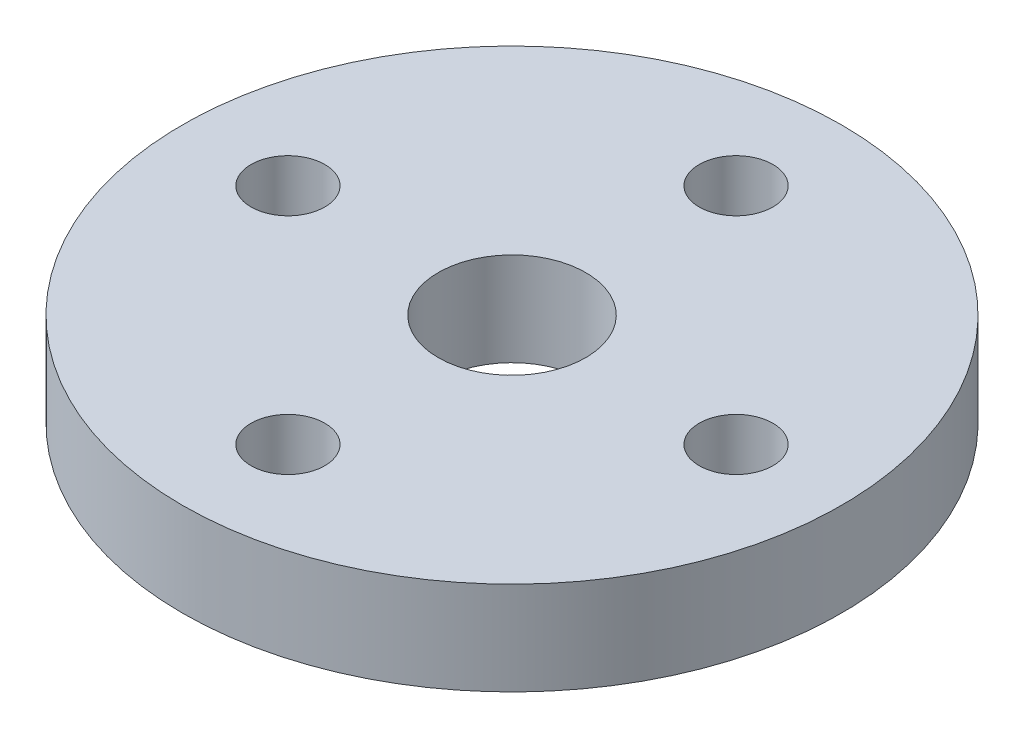
ISO-10303-21;
HEADER;
FILE_DESCRIPTION(('STEP AP214'),'2;1');
FILE_NAME('part.step','',(''),(''),'','','');
FILE_SCHEMA(('AUTOMOTIVE_DESIGN { 1 0 10303 214 1 1 1 1 }'));
ENDSEC;
DATA;
#1=APPLICATION_CONTEXT('core data for automotive mechanical design processes');
#2=APPLICATION_PROTOCOL_DEFINITION('international standard','automotive_design',2000,#1);
#3=PRODUCT_CONTEXT('',#1,'mechanical');
#4=PRODUCT('Part','Part','',(#3));
#5=PRODUCT_RELATED_PRODUCT_CATEGORY('part','',(#4));
#6=PRODUCT_DEFINITION_FORMATION('','',#4);
#7=PRODUCT_DEFINITION_CONTEXT('part definition',#1,'design');
#8=PRODUCT_DEFINITION('design','',#6,#7);
#9=PRODUCT_DEFINITION_SHAPE('','',#8);
#10=(LENGTH_UNIT() NAMED_UNIT(*) SI_UNIT(.MILLI.,.METRE.));
#11=(NAMED_UNIT(*) PLANE_ANGLE_UNIT() SI_UNIT($,.RADIAN.));
#12=(NAMED_UNIT(*) SI_UNIT($,.STERADIAN.) SOLID_ANGLE_UNIT());
#13=UNCERTAINTY_MEASURE_WITH_UNIT(LENGTH_MEASURE(1.E-05),#10,'distance_accuracy_value','');
#14=(GEOMETRIC_REPRESENTATION_CONTEXT(3) GLOBAL_UNCERTAINTY_ASSIGNED_CONTEXT((#13)) GLOBAL_UNIT_ASSIGNED_CONTEXT((#10,
#11,#12)) REPRESENTATION_CONTEXT('',''));
#15=CARTESIAN_POINT('',(0.,0.,0.));
#16=DIRECTION('',(0.,0.,1.));
#17=DIRECTION('',(1.,0.,0.));
#18=AXIS2_PLACEMENT_3D('',#15,#16,#17);
#19=CARTESIAN_POINT('',(0.,5.,0.));
#20=DIRECTION('',(0.,1.,0.));
#21=DIRECTION('',(0.,0.,1.));
#22=AXIS2_PLACEMENT_3D('',#19,#20,#21);
#23=PLANE('',#22);
#24=CARTESIAN_POINT('',(12.,5.,0.));
#25=DIRECTION('',(0.,1.,0.));
#26=DIRECTION('',(0.,0.,-1.));
#27=AXIS2_PLACEMENT_3D('',#24,#25,#26);
#28=CIRCLE('',#27,1.975);
#29=CARTESIAN_POINT('',(12.,5.,-1.975));
#30=VERTEX_POINT('',#29);
#31=EDGE_CURVE('E62',#30,#30,#28,.T.);
#32=ORIENTED_EDGE('',*,*,#31,.F.);
#33=EDGE_LOOP('',(#32));
#34=FACE_BOUND('',#33,.T.);
#35=CARTESIAN_POINT('',(0.,5.,-12.));
#36=DIRECTION('',(0.,1.,0.));
#37=DIRECTION('',(0.,0.,1.));
#38=AXIS2_PLACEMENT_3D('',#35,#36,#37);
#39=CIRCLE('',#38,1.975);
#40=CARTESIAN_POINT('',(0.,5.,-10.025));
#41=VERTEX_POINT('',#40);
#42=EDGE_CURVE('E50',#41,#41,#39,.T.);
#43=ORIENTED_EDGE('',*,*,#42,.F.);
#44=EDGE_LOOP('',(#43));
#45=FACE_BOUND('',#44,.T.);
#46=CARTESIAN_POINT('',(0.,5.,0.));
#47=DIRECTION('',(0.,1.,0.));
#48=DIRECTION('',(0.,0.,1.));
#49=AXIS2_PLACEMENT_3D('',#46,#47,#48);
#50=CIRCLE('',#49,17.65);
#51=CARTESIAN_POINT('',(0.,5.,17.65));
#52=VERTEX_POINT('',#51);
#53=EDGE_CURVE('E10',#52,#52,#50,.T.);
#54=ORIENTED_EDGE('',*,*,#53,.T.);
#55=EDGE_LOOP('',(#54));
#56=FACE_BOUND('',#55,.T.);
#57=CARTESIAN_POINT('',(0.,5.,0.));
#58=DIRECTION('',(0.,1.,0.));
#59=DIRECTION('',(0.,0.,1.));
#60=AXIS2_PLACEMENT_3D('',#57,#58,#59);
#61=CIRCLE('',#60,3.95);
#62=CARTESIAN_POINT('',(0.,5.,3.95));
#63=VERTEX_POINT('',#62);
#64=EDGE_CURVE('E45',#63,#63,#61,.T.);
#65=ORIENTED_EDGE('',*,*,#64,.F.);
#66=EDGE_LOOP('',(#65));
#67=FACE_BOUND('',#66,.T.);
#68=CARTESIAN_POINT('',(-12.,5.,0.));
#69=DIRECTION('',(0.,1.,0.));
#70=DIRECTION('',(0.,0.,1.));
#71=AXIS2_PLACEMENT_3D('',#68,#69,#70);
#72=CIRCLE('',#71,1.975);
#73=CARTESIAN_POINT('',(-12.,5.,1.975));
#74=VERTEX_POINT('',#73);
#75=EDGE_CURVE('E56',#74,#74,#72,.T.);
#76=ORIENTED_EDGE('',*,*,#75,.F.);
#77=EDGE_LOOP('',(#76));
#78=FACE_BOUND('',#77,.T.);
#79=CARTESIAN_POINT('',(0.,5.,12.));
#80=DIRECTION('',(0.,1.,0.));
#81=DIRECTION('',(0.,0.,-1.));
#82=AXIS2_PLACEMENT_3D('',#79,#80,#81);
#83=CIRCLE('',#82,1.975);
#84=CARTESIAN_POINT('',(0.,5.,10.025));
#85=VERTEX_POINT('',#84);
#86=EDGE_CURVE('E68',#85,#85,#83,.T.);
#87=ORIENTED_EDGE('',*,*,#86,.F.);
#88=EDGE_LOOP('',(#87));
#89=FACE_BOUND('',#88,.T.);
#90=ADVANCED_FACE('F34',(#34,#45,#56,#67,#78,#89),#23,.T.);
#91=CARTESIAN_POINT('',(0.,0.,0.));
#92=DIRECTION('',(0.,1.,0.));
#93=DIRECTION('',(0.,0.,1.));
#94=AXIS2_PLACEMENT_3D('',#91,#92,#93);
#95=PLANE('',#94);
#96=CARTESIAN_POINT('',(0.,0.,0.));
#97=DIRECTION('',(0.,1.,0.));
#98=DIRECTION('',(0.,0.,1.));
#99=AXIS2_PLACEMENT_3D('',#96,#97,#98);
#100=CIRCLE('',#99,17.65);
#101=CARTESIAN_POINT('',(0.,0.,17.65));
#102=VERTEX_POINT('',#101);
#103=EDGE_CURVE('E38',#102,#102,#100,.T.);
#104=ORIENTED_EDGE('',*,*,#103,.F.);
#105=EDGE_LOOP('',(#104));
#106=FACE_BOUND('',#105,.T.);
#107=CARTESIAN_POINT('',(0.,0.,0.));
#108=DIRECTION('',(0.,1.,0.));
#109=DIRECTION('',(0.,0.,1.));
#110=AXIS2_PLACEMENT_3D('',#107,#108,#109);
#111=CIRCLE('',#110,3.95);
#112=CARTESIAN_POINT('',(0.,0.,3.95));
#113=VERTEX_POINT('',#112);
#114=EDGE_CURVE('E47',#113,#113,#111,.T.);
#115=ORIENTED_EDGE('',*,*,#114,.T.);
#116=EDGE_LOOP('',(#115));
#117=FACE_BOUND('',#116,.T.);
#118=CARTESIAN_POINT('',(0.,0.,-12.));
#119=DIRECTION('',(0.,1.,0.));
#120=DIRECTION('',(0.,0.,1.));
#121=AXIS2_PLACEMENT_3D('',#118,#119,#120);
#122=CIRCLE('',#121,1.975);
#123=CARTESIAN_POINT('',(0.,0.,-10.025));
#124=VERTEX_POINT('',#123);
#125=EDGE_CURVE('E53',#124,#124,#122,.T.);
#126=ORIENTED_EDGE('',*,*,#125,.T.);
#127=EDGE_LOOP('',(#126));
#128=FACE_BOUND('',#127,.T.);
#129=CARTESIAN_POINT('',(-12.,0.,0.));
#130=DIRECTION('',(0.,1.,0.));
#131=DIRECTION('',(0.,0.,1.));
#132=AXIS2_PLACEMENT_3D('',#129,#130,#131);
#133=CIRCLE('',#132,1.975);
#134=CARTESIAN_POINT('',(-12.,0.,1.975));
#135=VERTEX_POINT('',#134);
#136=EDGE_CURVE('E59',#135,#135,#133,.T.);
#137=ORIENTED_EDGE('',*,*,#136,.T.);
#138=EDGE_LOOP('',(#137));
#139=FACE_BOUND('',#138,.T.);
#140=CARTESIAN_POINT('',(12.,0.,0.));
#141=DIRECTION('',(0.,1.,0.));
#142=DIRECTION('',(0.,0.,-1.));
#143=AXIS2_PLACEMENT_3D('',#140,#141,#142);
#144=CIRCLE('',#143,1.975);
#145=CARTESIAN_POINT('',(12.,0.,-1.975));
#146=VERTEX_POINT('',#145);
#147=EDGE_CURVE('E65',#146,#146,#144,.T.);
#148=ORIENTED_EDGE('',*,*,#147,.T.);
#149=EDGE_LOOP('',(#148));
#150=FACE_BOUND('',#149,.T.);
#151=CARTESIAN_POINT('',(0.,0.,12.));
#152=DIRECTION('',(0.,1.,0.));
#153=DIRECTION('',(0.,0.,-1.));
#154=AXIS2_PLACEMENT_3D('',#151,#152,#153);
#155=CIRCLE('',#154,1.975);
#156=CARTESIAN_POINT('',(0.,0.,10.025));
#157=VERTEX_POINT('',#156);
#158=EDGE_CURVE('E71',#157,#157,#155,.T.);
#159=ORIENTED_EDGE('',*,*,#158,.T.);
#160=EDGE_LOOP('',(#159));
#161=FACE_BOUND('',#160,.T.);
#162=ADVANCED_FACE('F81',(#106,#117,#128,#139,#150,#161),#95,.F.);
#163=CARTESIAN_POINT('',(0.,5.,0.));
#164=DIRECTION('',(0.,-1.,0.));
#165=DIRECTION('',(0.,0.,-1.));
#166=AXIS2_PLACEMENT_3D('',#163,#164,#165);
#167=CYLINDRICAL_SURFACE('',#166,17.65);
#168=ORIENTED_EDGE('',*,*,#53,.F.);
#169=EDGE_LOOP('',(#168));
#170=FACE_BOUND('',#169,.T.);
#171=ORIENTED_EDGE('',*,*,#103,.T.);
#172=EDGE_LOOP('',(#171));
#173=FACE_BOUND('',#172,.T.);
#174=ADVANCED_FACE('F36',(#170,#173),#167,.T.);
#175=CARTESIAN_POINT('',(0.,5.,0.));
#176=DIRECTION('',(0.,-1.,0.));
#177=DIRECTION('',(0.,0.,-1.));
#178=AXIS2_PLACEMENT_3D('',#175,#176,#177);
#179=CYLINDRICAL_SURFACE('',#178,3.95);
#180=ORIENTED_EDGE('',*,*,#64,.T.);
#181=EDGE_LOOP('',(#180));
#182=FACE_BOUND('',#181,.T.);
#183=ORIENTED_EDGE('',*,*,#114,.F.);
#184=EDGE_LOOP('',(#183));
#185=FACE_BOUND('',#184,.T.);
#186=ADVANCED_FACE('F91',(#182,#185),#179,.F.);
#187=CARTESIAN_POINT('',(0.,5.,-12.));
#188=DIRECTION('',(0.,-1.,0.));
#189=DIRECTION('',(0.,0.,-1.));
#190=AXIS2_PLACEMENT_3D('',#187,#188,#189);
#191=CYLINDRICAL_SURFACE('',#190,1.975);
#192=ORIENTED_EDGE('',*,*,#42,.T.);
#193=EDGE_LOOP('',(#192));
#194=FACE_BOUND('',#193,.T.);
#195=ORIENTED_EDGE('',*,*,#125,.F.);
#196=EDGE_LOOP('',(#195));
#197=FACE_BOUND('',#196,.T.);
#198=ADVANCED_FACE('F94',(#194,#197),#191,.F.);
#199=CARTESIAN_POINT('',(-12.,5.,0.));
#200=DIRECTION('',(0.,-1.,0.));
#201=DIRECTION('',(0.,0.,-1.));
#202=AXIS2_PLACEMENT_3D('',#199,#200,#201);
#203=CYLINDRICAL_SURFACE('',#202,1.975);
#204=ORIENTED_EDGE('',*,*,#75,.T.);
#205=EDGE_LOOP('',(#204));
#206=FACE_BOUND('',#205,.T.);
#207=ORIENTED_EDGE('',*,*,#136,.F.);
#208=EDGE_LOOP('',(#207));
#209=FACE_BOUND('',#208,.T.);
#210=ADVANCED_FACE('F98',(#206,#209),#203,.F.);
#211=CARTESIAN_POINT('',(12.,5.,0.));
#212=DIRECTION('',(0.,-1.,0.));
#213=DIRECTION('',(0.,0.,-1.));
#214=AXIS2_PLACEMENT_3D('',#211,#212,#213);
#215=CYLINDRICAL_SURFACE('',#214,1.975);
#216=ORIENTED_EDGE('',*,*,#31,.T.);
#217=EDGE_LOOP('',(#216));
#218=FACE_BOUND('',#217,.T.);
#219=ORIENTED_EDGE('',*,*,#147,.F.);
#220=EDGE_LOOP('',(#219));
#221=FACE_BOUND('',#220,.T.);
#222=ADVANCED_FACE('F102',(#218,#221),#215,.F.);
#223=CARTESIAN_POINT('',(0.,5.,12.));
#224=DIRECTION('',(0.,-1.,0.));
#225=DIRECTION('',(0.,0.,-1.));
#226=AXIS2_PLACEMENT_3D('',#223,#224,#225);
#227=CYLINDRICAL_SURFACE('',#226,1.975);
#228=ORIENTED_EDGE('',*,*,#86,.T.);
#229=EDGE_LOOP('',(#228));
#230=FACE_BOUND('',#229,.T.);
#231=ORIENTED_EDGE('',*,*,#158,.F.);
#232=EDGE_LOOP('',(#231));
#233=FACE_BOUND('',#232,.T.);
#234=ADVANCED_FACE('F77',(#230,#233),#227,.F.);
#235=CLOSED_SHELL('',(#90,#162,#174,#186,#198,#210,#222,#234));
#236=MANIFOLD_SOLID_BREP('B2',#235);
#237=ADVANCED_BREP_SHAPE_REPRESENTATION('',(#18,#236),#14);
#238=SHAPE_DEFINITION_REPRESENTATION(#9,#237);
ENDSEC;
END-ISO-10303-21;
